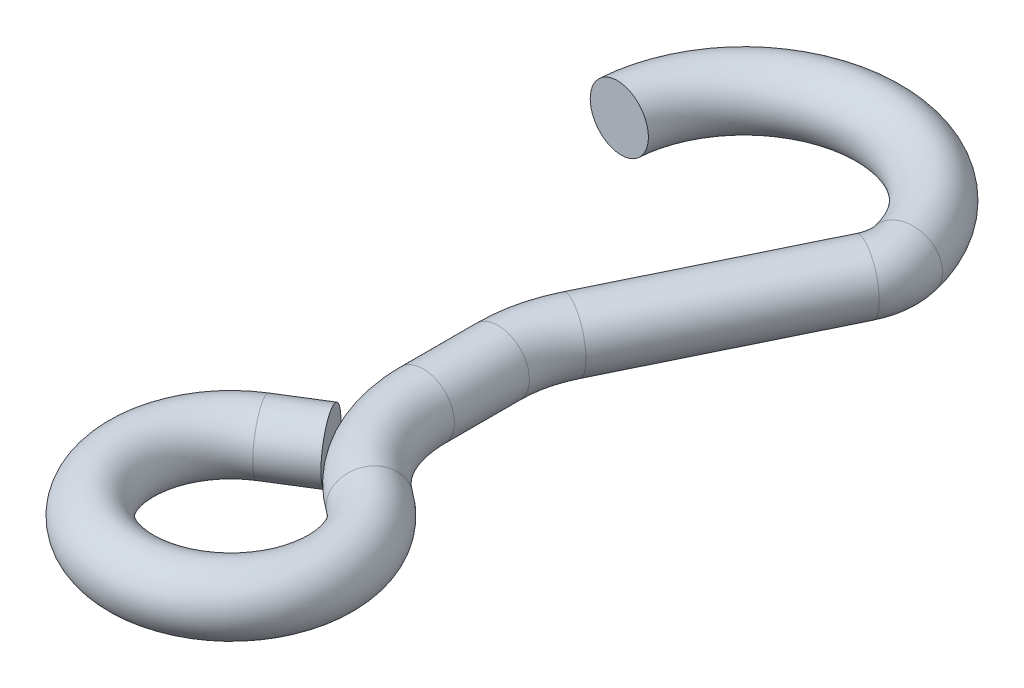
ISO-10303-21;
HEADER;
FILE_DESCRIPTION(('STEP AP214'),'2;1');
FILE_NAME('part.step','',(''),(''),'','','');
FILE_SCHEMA(('AUTOMOTIVE_DESIGN { 1 0 10303 214 1 1 1 1 }'));
ENDSEC;
DATA;
#1=APPLICATION_CONTEXT('core data for automotive mechanical design processes');
#2=APPLICATION_PROTOCOL_DEFINITION('international standard','automotive_design',2000,#1);
#3=PRODUCT_CONTEXT('',#1,'mechanical');
#4=PRODUCT('Part','Part','',(#3));
#5=PRODUCT_RELATED_PRODUCT_CATEGORY('part','',(#4));
#6=PRODUCT_DEFINITION_FORMATION('','',#4);
#7=PRODUCT_DEFINITION_CONTEXT('part definition',#1,'design');
#8=PRODUCT_DEFINITION('design','',#6,#7);
#9=PRODUCT_DEFINITION_SHAPE('','',#8);
#10=(LENGTH_UNIT() NAMED_UNIT(*) SI_UNIT(.MILLI.,.METRE.));
#11=(NAMED_UNIT(*) PLANE_ANGLE_UNIT() SI_UNIT($,.RADIAN.));
#12=(NAMED_UNIT(*) SI_UNIT($,.STERADIAN.) SOLID_ANGLE_UNIT());
#13=UNCERTAINTY_MEASURE_WITH_UNIT(LENGTH_MEASURE(1.E-05),#10,'distance_accuracy_value','');
#14=(GEOMETRIC_REPRESENTATION_CONTEXT(3) GLOBAL_UNCERTAINTY_ASSIGNED_CONTEXT((#13)) GLOBAL_UNIT_ASSIGNED_CONTEXT((#10,
#11,#12)) REPRESENTATION_CONTEXT('',''));
#15=CARTESIAN_POINT('',(0.,0.,0.));
#16=DIRECTION('',(0.,0.,1.));
#17=DIRECTION('',(1.,0.,0.));
#18=AXIS2_PLACEMENT_3D('',#15,#16,#17);
#19=CARTESIAN_POINT('',(-0.389174215317771,0.,-0.408973264858322));
#20=DIRECTION('',(-0.848943325203682,0.,0.528483898138926));
#21=DIRECTION('',(0.528483898138926,0.,0.848943325203682));
#22=AXIS2_PLACEMENT_3D('',#19,#20,#21);
#23=PLANE('',#22);
#24=CARTESIAN_POINT('',(-0.389174215317771,0.,-0.408973264858322));
#25=DIRECTION('',(-0.848943325203682,0.,0.528483898138926));
#26=DIRECTION('',(0.528483898138926,0.,0.848943325203682));
#27=AXIS2_PLACEMENT_3D('',#24,#25,#26);
#28=CIRCLE('',#27,1.15);
#29=CARTESIAN_POINT('',(0.218582267541994,0.,0.567311559125912));
#30=VERTEX_POINT('',#29);
#31=EDGE_CURVE('E79',#30,#30,#28,.T.);
#32=ORIENTED_EDGE('',*,*,#31,.F.);
#33=EDGE_LOOP('',(#32));
#34=FACE_BOUND('',#33,.T.);
#35=ADVANCED_FACE('F47',(#34),#23,.F.);
#36=CARTESIAN_POINT('',(-5.53582813906918,0.,-16.1603167796925));
#37=DIRECTION('',(-0.0675651120860144,0.,0.997714866897755));
#38=DIRECTION('',(0.997714866897754,0.,0.0675651120860145));
#39=AXIS2_PLACEMENT_3D('',#36,#37,#38);
#40=PLANE('',#39);
#41=CARTESIAN_POINT('',(-5.53582813906918,0.,-16.1603167796925));
#42=DIRECTION('',(-0.0675651120860144,0.,0.997714866897755));
#43=DIRECTION('',(0.997714866897754,0.,0.0675651120860145));
#44=AXIS2_PLACEMENT_3D('',#41,#42,#43);
#45=CIRCLE('',#44,1.15);
#46=CARTESIAN_POINT('',(-6.6832002360016,0.,-16.2380166585914));
#47=VERTEX_POINT('',#46);
#48=EDGE_CURVE('E11',#47,#47,#45,.T.);
#49=ORIENTED_EDGE('',*,*,#48,.T.);
#50=EDGE_LOOP('',(#49));
#51=FACE_BOUND('',#50,.T.);
#52=ADVANCED_FACE('F90',(#51),#40,.T.);
#53=CARTESIAN_POINT('',(-0.389174215317771,0.,-0.408973264858322));
#54=DIRECTION('',(-0.848943325203682,0.,0.528483898138926));
#55=DIRECTION('',(0.528483898138926,0.,0.848943325203682));
#56=AXIS2_PLACEMENT_3D('',#53,#54,#55);
#57=CYLINDRICAL_SURFACE('',#56,1.15);
#58=CARTESIAN_POINT('',(-1.93425106718847,0.,0.552867429754524));
#59=DIRECTION('',(-0.848943325203682,0.,0.528483898138926));
#60=DIRECTION('',(0.528483898138926,0.,0.848943325203682));
#61=AXIS2_PLACEMENT_3D('',#58,#59,#60);
#62=CIRCLE('',#61,1.15);
#63=CARTESIAN_POINT('',(-2.54200755004824,0.,-0.42341739422971));
#64=VERTEX_POINT('',#63);
#65=EDGE_CURVE('E77',#64,#64,#62,.T.);
#66=ORIENTED_EDGE('',*,*,#65,.F.);
#67=EDGE_LOOP('',(#66));
#68=FACE_BOUND('',#67,.T.);
#69=ORIENTED_EDGE('',*,*,#31,.T.);
#70=EDGE_LOOP('',(#69));
#71=FACE_BOUND('',#70,.T.);
#72=ADVANCED_FACE('F84',(#68,#71),#57,.T.);
#73=CARTESIAN_POINT('',(0.,0.,3.66));
#74=DIRECTION('',(0.,1.,0.));
#75=DIRECTION('',(0.,0.,1.));
#76=AXIS2_PLACEMENT_3D('',#73,#74,#75);
#77=TOROIDAL_SURFACE('',#76,3.66,1.15);
#78=CARTESIAN_POINT('',(2.11316397228637,0.,0.671666346233928));
#79=DIRECTION('',(-0.816484604854118,0.,-0.577367205542725));
#80=DIRECTION('',(-0.577367205542725,0.,0.816484604854118));
#81=AXIS2_PLACEMENT_3D('',#78,#79,#80);
#82=CIRCLE('',#81,1.15);
#83=CARTESIAN_POINT('',(2.77713625866051,0.,-0.267290949348307));
#84=VERTEX_POINT('',#83);
#85=EDGE_CURVE('E74',#84,#84,#82,.T.);
#86=CARTESIAN_POINT('',(0.,0.,3.66));
#87=DIRECTION('',(0.,1.,0.));
#88=DIRECTION('',(0.,0.,1.));
#89=AXIS2_PLACEMENT_3D('',#86,#87,#88);
#90=CIRCLE('',#89,4.81);
#91=EDGE_CURVE('',#64,#84,#90,.T.);
#92=ORIENTED_EDGE('',*,*,#65,.T.);
#93=ORIENTED_EDGE('',*,*,#85,.F.);
#94=ORIENTED_EDGE('',*,*,#91,.T.);
#95=ORIENTED_EDGE('',*,*,#91,.F.);
#96=EDGE_LOOP('',(#92,#94,#93,#95));
#97=FACE_BOUND('',#96,.T.);
#98=ADVANCED_FACE('F120',(#97),#77,.T.);
#99=CARTESIAN_POINT('',(5.,0.,-3.41075667803666));
#100=DIRECTION('',(0.,-1.,0.));
#101=DIRECTION('',(0.,0.,-1.));
#102=AXIS2_PLACEMENT_3D('',#99,#100,#101);
#103=TOROIDAL_SURFACE('',#102,5.,1.15);
#104=CARTESIAN_POINT('',(0.,0.,-3.41075667803666));
#105=DIRECTION('',(0.,0.,-1.));
#106=DIRECTION('',(-1.,0.,0.));
#107=AXIS2_PLACEMENT_3D('',#104,#105,#106);
#108=CIRCLE('',#107,1.15);
#109=CARTESIAN_POINT('',(-1.15,0.,-3.41075667803666));
#110=VERTEX_POINT('',#109);
#111=EDGE_CURVE('E72',#110,#110,#108,.T.);
#112=ORIENTED_EDGE('',*,*,#111,.F.);
#113=EDGE_LOOP('',(#112));
#114=FACE_BOUND('',#113,.T.);
#115=ORIENTED_EDGE('',*,*,#85,.T.);
#116=EDGE_LOOP('',(#115));
#117=FACE_BOUND('',#116,.T.);
#118=ADVANCED_FACE('F111',(#114,#117),#103,.T.);
#119=CARTESIAN_POINT('',(0.,0.,-3.41075667803666));
#120=DIRECTION('',(0.,0.,-1.));
#121=DIRECTION('',(-1.,0.,0.));
#122=AXIS2_PLACEMENT_3D('',#119,#120,#121);
#123=CYLINDRICAL_SURFACE('',#122,1.15);
#124=CARTESIAN_POINT('',(0.,0.,-6.17083034894393));
#125=DIRECTION('',(0.,0.,-1.));
#126=DIRECTION('',(-1.,0.,0.));
#127=AXIS2_PLACEMENT_3D('',#124,#125,#126);
#128=CIRCLE('',#127,1.15);
#129=CARTESIAN_POINT('',(-1.15,0.,-6.17083034894393));
#130=VERTEX_POINT('',#129);
#131=EDGE_CURVE('E66',#130,#130,#128,.T.);
#132=CARTESIAN_POINT('',(-1.15,0.,-6.17083034894393));
#133=CARTESIAN_POINT('',(-1.15,0.,-6.14207958153865));
#134=CARTESIAN_POINT('',(-1.15,0.,-6.11332881413336));
#135=CARTESIAN_POINT('',(-1.15,0.,-6.05582727932279));
#136=CARTESIAN_POINT('',(-1.15,0.,-6.02707651191751));
#137=CARTESIAN_POINT('',(-1.15,0.,-5.96957497710694));
#138=CARTESIAN_POINT('',(-1.15,0.,-5.94082420970166));
#139=CARTESIAN_POINT('',(-1.15,0.,-5.88332267489109));
#140=CARTESIAN_POINT('',(-1.15,0.,-5.85457190748581));
#141=CARTESIAN_POINT('',(-1.15,0.,-5.79707037267524));
#142=CARTESIAN_POINT('',(-1.15,0.,-5.76831960526995));
#143=CARTESIAN_POINT('',(-1.15,0.,-5.71081807045939));
#144=CARTESIAN_POINT('',(-1.15,0.,-5.6820673030541));
#145=CARTESIAN_POINT('',(-1.15,0.,-5.62456576824353));
#146=CARTESIAN_POINT('',(-1.15,0.,-5.59581500083825));
#147=CARTESIAN_POINT('',(-1.15,0.,-5.53831346602768));
#148=CARTESIAN_POINT('',(-1.15,0.,-5.5095626986224));
#149=CARTESIAN_POINT('',(-1.15,0.,-5.45206116381183));
#150=CARTESIAN_POINT('',(-1.15,0.,-5.42331039640655));
#151=CARTESIAN_POINT('',(-1.15,0.,-5.36580886159598));
#152=CARTESIAN_POINT('',(-1.15,0.,-5.33705809419069));
#153=CARTESIAN_POINT('',(-1.15,0.,-5.27955655938012));
#154=CARTESIAN_POINT('',(-1.15,0.,-5.25080579197484));
#155=CARTESIAN_POINT('',(-1.15,0.,-5.19330425716427));
#156=CARTESIAN_POINT('',(-1.15,0.,-5.16455348975899));
#157=CARTESIAN_POINT('',(-1.15,0.,-5.10705195494842));
#158=CARTESIAN_POINT('',(-1.15,0.,-5.07830118754314));
#159=CARTESIAN_POINT('',(-1.15,0.,-5.02079965273257));
#160=CARTESIAN_POINT('',(-1.15,0.,-4.99204888532728));
#161=CARTESIAN_POINT('',(-1.15,0.,-4.93454735051672));
#162=CARTESIAN_POINT('',(-1.15,0.,-4.90579658311143));
#163=CARTESIAN_POINT('',(-1.15,0.,-4.84829504830086));
#164=CARTESIAN_POINT('',(-1.15,0.,-4.81954428089558));
#165=CARTESIAN_POINT('',(-1.15,0.,-4.76204274608501));
#166=CARTESIAN_POINT('',(-1.15,0.,-4.73329197867973));
#167=CARTESIAN_POINT('',(-1.15,0.,-4.67579044386916));
#168=CARTESIAN_POINT('',(-1.15,0.,-4.64703967646388));
#169=CARTESIAN_POINT('',(-1.15,0.,-4.58953814165331));
#170=CARTESIAN_POINT('',(-1.15,0.,-4.56078737424802));
#171=CARTESIAN_POINT('',(-1.15,0.,-4.50328583943746));
#172=CARTESIAN_POINT('',(-1.15,0.,-4.47453507203217));
#173=CARTESIAN_POINT('',(-1.15,0.,-4.4170335372216));
#174=CARTESIAN_POINT('',(-1.15,0.,-4.38828276981632));
#175=CARTESIAN_POINT('',(-1.15,0.,-4.33078123500575));
#176=CARTESIAN_POINT('',(-1.15,0.,-4.30203046760047));
#177=CARTESIAN_POINT('',(-1.15,0.,-4.2445289327899));
#178=CARTESIAN_POINT('',(-1.15,0.,-4.21577816538461));
#179=CARTESIAN_POINT('',(-1.15,0.,-4.15827663057405));
#180=CARTESIAN_POINT('',(-1.15,0.,-4.12952586316876));
#181=CARTESIAN_POINT('',(-1.15,0.,-4.07202432835819));
#182=CARTESIAN_POINT('',(-1.15,0.,-4.04327356095291));
#183=CARTESIAN_POINT('',(-1.15,0.,-3.98577202614234));
#184=CARTESIAN_POINT('',(-1.15,0.,-3.95702125873706));
#185=CARTESIAN_POINT('',(-1.15,0.,-3.89951972392649));
#186=CARTESIAN_POINT('',(-1.15,0.,-3.87076895652121));
#187=CARTESIAN_POINT('',(-1.15,0.,-3.81326742171064));
#188=CARTESIAN_POINT('',(-1.15,0.,-3.78451665430535));
#189=CARTESIAN_POINT('',(-1.15,0.,-3.72701511949479));
#190=CARTESIAN_POINT('',(-1.15,0.,-3.6982643520895));
#191=CARTESIAN_POINT('',(-1.15,0.,-3.64076281727893));
#192=CARTESIAN_POINT('',(-1.15,0.,-3.61201204987365));
#193=CARTESIAN_POINT('',(-1.15,0.,-3.55451051506308));
#194=CARTESIAN_POINT('',(-1.15,0.,-3.5257597476578));
#195=CARTESIAN_POINT('',(-1.15,0.,-3.46825821284723));
#196=CARTESIAN_POINT('',(-1.15,0.,-3.43950744544194));
#197=CARTESIAN_POINT('',(-1.15,0.,-3.41075667803666));
#198=B_SPLINE_CURVE_WITH_KNOTS('',3,(#132,#133,#134,#135,#136,#137,#138,#139,#140,#141,#142,
#143,#144,#145,#146,#147,#148,#149,#150,#151,#152,#153,#154,#155,#156,#157,#158,#159,#160,#161,
#162,#163,#164,#165,#166,#167,#168,#169,#170,#171,#172,#173,#174,#175,#176,#177,#178,#179,#180,
#181,#182,#183,#184,#185,#186,#187,#188,#189,#190,#191,#192,#193,#194,#195,#196,#197),
.UNSPECIFIED.,.F.,.F.,(4,2,2,2,2,2,2,2,2,2,2,2,2,2,2,2,2,2,2,2,2,2,2,2,2,2,2,2,2,2,2,2,4),(0.,
0.0862523022158524,0.172504604431704,0.258756906647557,0.345009208863409,0.431261511079261,
0.517513813295113,0.603766115510965,0.690018417726817,0.77627071994267,0.862523022158521,
0.948775324374374,1.03502762659023,1.12127992880608,1.20753223102193,1.29378453323778,
1.38003683545363,1.46628913766949,1.55254143988534,1.63879374210119,1.72504604431704,
1.8112983465329,1.89755064874875,1.9838029509646,2.07005525318045,2.1563075553963,
2.24255985761216,2.32881215982801,2.41506446204386,2.50131676425971,2.58756906647557,
2.67382136869142,2.76007367090727),.UNSPECIFIED.);
#199=EDGE_CURVE('BSEAM109',#130,#110,#198,.T.);
#200=ORIENTED_EDGE('',*,*,#131,.F.);
#201=ORIENTED_EDGE('',*,*,#111,.T.);
#202=ORIENTED_EDGE('',*,*,#199,.T.);
#203=ORIENTED_EDGE('',*,*,#199,.F.);
#204=EDGE_LOOP('',(#200,#202,#201,#203));
#205=FACE_BOUND('',#204,.T.);
#206=ADVANCED_FACE('F109',(#205),#123,.T.);
#207=CARTESIAN_POINT('',(5.,0.,-6.17083034894395));
#208=DIRECTION('',(0.,-1.,0.));
#209=DIRECTION('',(0.,0.,-1.));
#210=AXIS2_PLACEMENT_3D('',#207,#208,#209);
#211=TOROIDAL_SURFACE('',#210,5.,1.15);
#212=CARTESIAN_POINT('',(0.506029768504058,0.,-8.36268608288911));
#213=DIRECTION('',(0.438371146789033,0.,-0.898794046299188));
#214=DIRECTION('',(-0.898794046299188,0.,-0.438371146789033));
#215=AXIS2_PLACEMENT_3D('',#212,#213,#214);
#216=CIRCLE('',#215,1.15);
#217=CARTESIAN_POINT('',(-0.527583384740009,0.,-8.8668129016965));
#218=VERTEX_POINT('',#217);
#219=EDGE_CURVE('E63',#218,#218,#216,.T.);
#220=CARTESIAN_POINT('',(5.,0.,-6.17083034894395));
#221=DIRECTION('',(0.,-1.,0.));
#222=DIRECTION('',(0.,0.,-1.));
#223=AXIS2_PLACEMENT_3D('',#220,#221,#222);
#224=CIRCLE('',#223,6.15);
#225=EDGE_CURVE('',#130,#218,#224,.T.);
#226=ORIENTED_EDGE('',*,*,#131,.T.);
#227=ORIENTED_EDGE('',*,*,#219,.F.);
#228=ORIENTED_EDGE('',*,*,#225,.T.);
#229=ORIENTED_EDGE('',*,*,#225,.F.);
#230=EDGE_LOOP('',(#226,#228,#227,#229));
#231=FACE_BOUND('',#230,.T.);
#232=ADVANCED_FACE('F103',(#231),#211,.T.);
#233=CARTESIAN_POINT('',(0.506029768504058,0.,-8.36268608288911));
#234=DIRECTION('',(0.438371146789031,0.,-0.89879404629919));
#235=DIRECTION('',(-0.89879404629919,0.,-0.438371146789031));
#236=AXIS2_PLACEMENT_3D('',#233,#234,#235);
#237=CYLINDRICAL_SURFACE('',#236,1.15);
#238=CARTESIAN_POINT('',(4.04221811309279,0.,-15.6129466303483));
#239=DIRECTION('',(0.438371146789031,0.,-0.898794046299189));
#240=DIRECTION('',(-0.898794046299189,0.,-0.438371146789031));
#241=AXIS2_PLACEMENT_3D('',#238,#239,#240);
#242=CIRCLE('',#241,1.15);
#243=CARTESIAN_POINT('',(5.07583126633686,0.,-15.1088198115409));
#244=VERTEX_POINT('',#243);
#245=EDGE_CURVE('E56',#244,#244,#242,.T.);
#246=ORIENTED_EDGE('',*,*,#245,.F.);
#247=EDGE_LOOP('',(#246));
#248=FACE_BOUND('',#247,.T.);
#249=ORIENTED_EDGE('',*,*,#219,.T.);
#250=EDGE_LOOP('',(#249));
#251=FACE_BOUND('',#250,.T.);
#252=ADVANCED_FACE('F98',(#248,#251),#237,.T.);
#253=CARTESIAN_POINT('',(2.24463002049441,0.,-16.4896889239263));
#254=DIRECTION('',(0.,1.,0.));
#255=DIRECTION('',(0.,0.,1.));
#256=AXIS2_PLACEMENT_3D('',#253,#254,#255);
#257=TOROIDAL_SURFACE('',#256,2.,1.15);
#258=CARTESIAN_POINT('',(4.19293382307297,0.,-16.9414768087328));
#259=DIRECTION('',(-0.225893942403249,0.,-0.974151901289279));
#260=DIRECTION('',(-0.974151901289279,0.,0.225893942403249));
#261=AXIS2_PLACEMENT_3D('',#258,#259,#260);
#262=CIRCLE('',#261,1.15);
#263=CARTESIAN_POINT('',(5.31320850955564,0.,-17.2012548424966));
#264=VERTEX_POINT('',#263);
#265=EDGE_CURVE('E54',#264,#264,#262,.T.);
#266=CARTESIAN_POINT('',(2.24463002049441,0.,-16.4896889239263));
#267=DIRECTION('',(0.,1.,0.));
#268=DIRECTION('',(0.,0.,1.));
#269=AXIS2_PLACEMENT_3D('',#266,#267,#268);
#270=CIRCLE('',#269,3.15);
#271=EDGE_CURVE('',#244,#264,#270,.T.);
#272=ORIENTED_EDGE('',*,*,#245,.T.);
#273=ORIENTED_EDGE('',*,*,#265,.F.);
#274=ORIENTED_EDGE('',*,*,#271,.T.);
#275=ORIENTED_EDGE('',*,*,#271,.F.);
#276=EDGE_LOOP('',(#272,#274,#273,#275));
#277=FACE_BOUND('',#276,.T.);
#278=ADVANCED_FACE('F93',(#277),#257,.T.);
#279=CARTESIAN_POINT('',(-0.613319883066199,0.,-15.8269652049131));
#280=DIRECTION('',(0.,1.,0.));
#281=DIRECTION('',(0.,0.,1.));
#282=AXIS2_PLACEMENT_3D('',#279,#280,#281);
#283=TOROIDAL_SURFACE('',#282,4.93378260595513,1.15);
#284=CARTESIAN_POINT('',(-0.613319883066199,0.,-15.8269652049131));
#285=DIRECTION('',(0.,1.,0.));
#286=DIRECTION('',(0.,0.,1.));
#287=AXIS2_PLACEMENT_3D('',#284,#285,#286);
#288=CIRCLE('',#287,6.08378260595513);
#289=EDGE_CURVE('',#264,#47,#288,.T.);
#290=ORIENTED_EDGE('',*,*,#265,.T.);
#291=ORIENTED_EDGE('',*,*,#48,.F.);
#292=ORIENTED_EDGE('',*,*,#289,.T.);
#293=ORIENTED_EDGE('',*,*,#289,.F.);
#294=EDGE_LOOP('',(#290,#292,#291,#293));
#295=FACE_BOUND('',#294,.T.);
#296=ADVANCED_FACE('F91',(#295),#283,.T.);
#297=CLOSED_SHELL('',(#35,#52,#72,#98,#118,#206,#232,#252,#278,#296));
#298=MANIFOLD_SOLID_BREP('B2',#297);
#299=ADVANCED_BREP_SHAPE_REPRESENTATION('',(#18,#298),#14);
#300=SHAPE_DEFINITION_REPRESENTATION(#9,#299);
ENDSEC;
END-ISO-10303-21;
